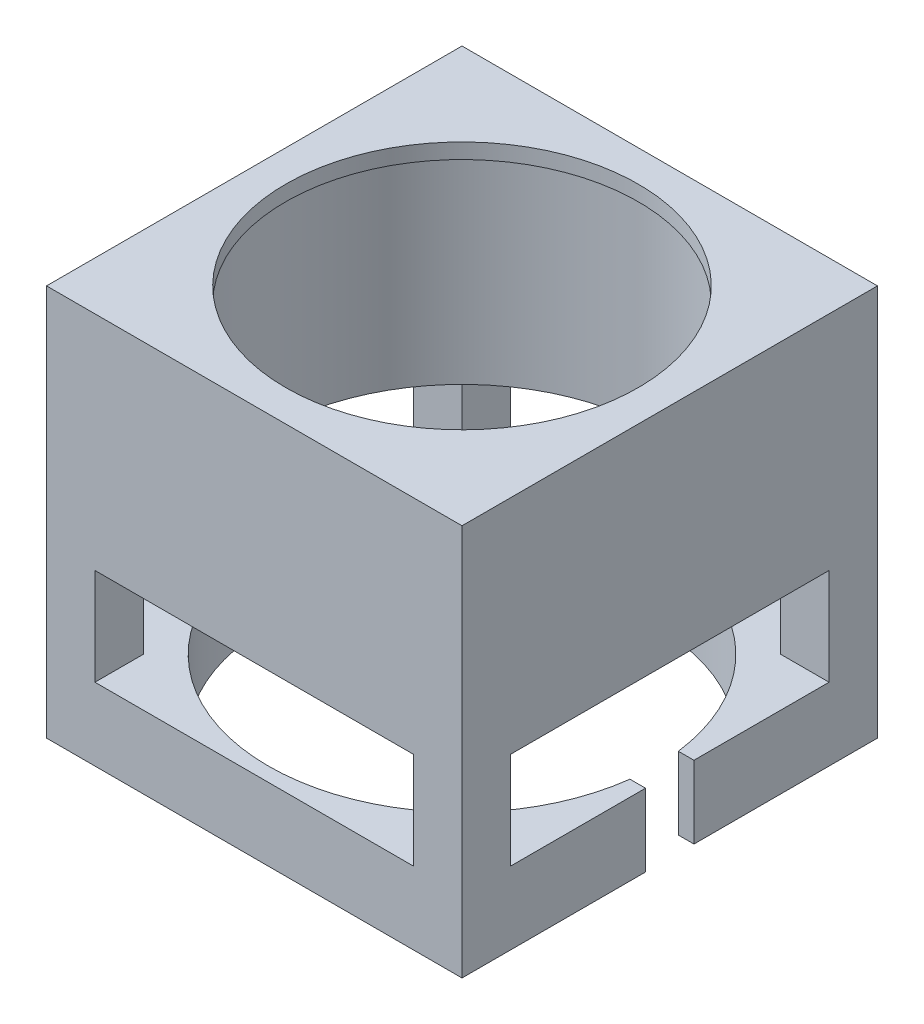
ISO-10303-21;
HEADER;
FILE_DESCRIPTION(('STEP AP214'),'2;1');
FILE_NAME('part.step','',(''),(''),'','','');
FILE_SCHEMA(('AUTOMOTIVE_DESIGN { 1 0 10303 214 1 1 1 1 }'));
ENDSEC;
DATA;
#1=APPLICATION_CONTEXT('core data for automotive mechanical design processes');
#2=APPLICATION_PROTOCOL_DEFINITION('international standard','automotive_design',2000,#1);
#3=PRODUCT_CONTEXT('',#1,'mechanical');
#4=PRODUCT('Part','Part','',(#3));
#5=PRODUCT_RELATED_PRODUCT_CATEGORY('part','',(#4));
#6=PRODUCT_DEFINITION_FORMATION('','',#4);
#7=PRODUCT_DEFINITION_CONTEXT('part definition',#1,'design');
#8=PRODUCT_DEFINITION('design','',#6,#7);
#9=PRODUCT_DEFINITION_SHAPE('','',#8);
#10=(LENGTH_UNIT() NAMED_UNIT(*) SI_UNIT(.MILLI.,.METRE.));
#11=(NAMED_UNIT(*) PLANE_ANGLE_UNIT() SI_UNIT($,.RADIAN.));
#12=(NAMED_UNIT(*) SI_UNIT($,.STERADIAN.) SOLID_ANGLE_UNIT());
#13=UNCERTAINTY_MEASURE_WITH_UNIT(LENGTH_MEASURE(1.E-05),#10,'distance_accuracy_value','');
#14=(GEOMETRIC_REPRESENTATION_CONTEXT(3) GLOBAL_UNCERTAINTY_ASSIGNED_CONTEXT((#13)) GLOBAL_UNIT_ASSIGNED_CONTEXT((#10,
#11,#12)) REPRESENTATION_CONTEXT('',''));
#15=CARTESIAN_POINT('',(0.,0.,0.));
#16=DIRECTION('',(0.,0.,1.));
#17=DIRECTION('',(1.,0.,0.));
#18=AXIS2_PLACEMENT_3D('',#15,#16,#17);
#19=CARTESIAN_POINT('',(0.,38.1,0.));
#20=DIRECTION('',(0.,-1.,0.));
#21=DIRECTION('',(0.,0.,-1.));
#22=AXIS2_PLACEMENT_3D('',#19,#20,#21);
#23=PLANE('',#22);
#24=CARTESIAN_POINT('',(0.,38.1,0.));
#25=DIRECTION('',(0.,1.,0.));
#26=DIRECTION('',(0.,0.,1.));
#27=AXIS2_PLACEMENT_3D('',#24,#25,#26);
#28=CIRCLE('',#27,101.6);
#29=CARTESIAN_POINT('',(100.803124951561,38.1,-12.7));
#30=VERTEX_POINT('',#29);
#31=CARTESIAN_POINT('',(100.803124951561,38.1,12.7));
#32=VERTEX_POINT('',#31);
#33=EDGE_CURVE('E196',#30,#32,#28,.T.);
#34=ORIENTED_EDGE('',*,*,#33,.F.);
#35=DIRECTION('',(-1.,0.,0.));
#36=VECTOR('',#35,1.);
#37=CARTESIAN_POINT('',(117.196875048439,38.1,-12.7));
#38=LINE('',#37,#36);
#39=CARTESIAN_POINT('',(109.,38.1,-12.7));
#40=VERTEX_POINT('',#39);
#41=EDGE_CURVE('E69',#40,#30,#38,.T.);
#42=ORIENTED_EDGE('',*,*,#41,.F.);
#43=DIRECTION('',(0.,0.,-1.));
#44=VECTOR('',#43,1.);
#45=CARTESIAN_POINT('',(109.,38.1,109.));
#46=LINE('',#45,#44);
#47=CARTESIAN_POINT('',(109.,38.1,-83.6));
#48=VERTEX_POINT('',#47);
#49=EDGE_CURVE('E220',#40,#48,#46,.T.);
#50=ORIENTED_EDGE('',*,*,#49,.T.);
#51=DIRECTION('',(1.,0.,0.));
#52=VECTOR('',#51,1.);
#53=CARTESIAN_POINT('',(109.,38.1,-83.6));
#54=LINE('',#53,#52);
#55=CARTESIAN_POINT('',(83.6,38.1,-83.6));
#56=VERTEX_POINT('',#55);
#57=EDGE_CURVE('E379',#56,#48,#54,.T.);
#58=ORIENTED_EDGE('',*,*,#57,.F.);
#59=DIRECTION('',(0.,0.,1.));
#60=VECTOR('',#59,1.);
#61=CARTESIAN_POINT('',(83.6,38.1,-109.));
#62=LINE('',#61,#60);
#63=CARTESIAN_POINT('',(83.6,38.1,-109.));
#64=VERTEX_POINT('',#63);
#65=EDGE_CURVE('E383',#64,#56,#62,.T.);
#66=ORIENTED_EDGE('',*,*,#65,.F.);
#67=DIRECTION('',(-1.,0.,0.));
#68=VECTOR('',#67,1.);
#69=CARTESIAN_POINT('',(-109.,38.1,-109.));
#70=LINE('',#69,#68);
#71=CARTESIAN_POINT('',(-83.6,38.1,-109.));
#72=VERTEX_POINT('',#71);
#73=EDGE_CURVE('E219',#64,#72,#70,.T.);
#74=ORIENTED_EDGE('',*,*,#73,.T.);
#75=DIRECTION('',(0.,0.,-1.));
#76=VECTOR('',#75,1.);
#77=CARTESIAN_POINT('',(-83.6,38.1,-109.));
#78=LINE('',#77,#76);
#79=CARTESIAN_POINT('',(-83.6,38.1,-83.6));
#80=VERTEX_POINT('',#79);
#81=EDGE_CURVE('E400',#80,#72,#78,.T.);
#82=ORIENTED_EDGE('',*,*,#81,.F.);
#83=DIRECTION('',(1.,0.,0.));
#84=VECTOR('',#83,1.);
#85=CARTESIAN_POINT('',(-109.,38.1,-83.6));
#86=LINE('',#85,#84);
#87=CARTESIAN_POINT('',(-109.,38.1,-83.6));
#88=VERTEX_POINT('',#87);
#89=EDGE_CURVE('E388',#88,#80,#86,.T.);
#90=ORIENTED_EDGE('',*,*,#89,.F.);
#91=DIRECTION('',(0.,0.,1.));
#92=VECTOR('',#91,1.);
#93=CARTESIAN_POINT('',(-109.,38.1,109.));
#94=LINE('',#93,#92);
#95=CARTESIAN_POINT('',(-109.,38.1,83.6));
#96=VERTEX_POINT('',#95);
#97=EDGE_CURVE('E223',#88,#96,#94,.T.);
#98=ORIENTED_EDGE('',*,*,#97,.T.);
#99=DIRECTION('',(-1.,0.,0.));
#100=VECTOR('',#99,1.);
#101=CARTESIAN_POINT('',(-109.,38.1,83.6));
#102=LINE('',#101,#100);
#103=CARTESIAN_POINT('',(-83.6,38.1,83.6));
#104=VERTEX_POINT('',#103);
#105=EDGE_CURVE('E323',#104,#96,#102,.T.);
#106=ORIENTED_EDGE('',*,*,#105,.F.);
#107=DIRECTION('',(0.,0.,-1.));
#108=VECTOR('',#107,1.);
#109=CARTESIAN_POINT('',(-83.6,38.1,109.));
#110=LINE('',#109,#108);
#111=CARTESIAN_POINT('',(-83.6,38.1,109.));
#112=VERTEX_POINT('',#111);
#113=EDGE_CURVE('E327',#112,#104,#110,.T.);
#114=ORIENTED_EDGE('',*,*,#113,.F.);
#115=DIRECTION('',(1.,0.,0.));
#116=VECTOR('',#115,1.);
#117=CARTESIAN_POINT('',(-109.,38.1,109.));
#118=LINE('',#117,#116);
#119=CARTESIAN_POINT('',(83.6,38.1,109.));
#120=VERTEX_POINT('',#119);
#121=EDGE_CURVE('E226',#112,#120,#118,.T.);
#122=ORIENTED_EDGE('',*,*,#121,.T.);
#123=DIRECTION('',(0.,0.,1.));
#124=VECTOR('',#123,1.);
#125=CARTESIAN_POINT('',(83.6,38.1,109.));
#126=LINE('',#125,#124);
#127=CARTESIAN_POINT('',(83.6,38.1,83.6));
#128=VERTEX_POINT('',#127);
#129=EDGE_CURVE('E351',#128,#120,#126,.T.);
#130=ORIENTED_EDGE('',*,*,#129,.F.);
#131=DIRECTION('',(-1.,0.,0.));
#132=VECTOR('',#131,1.);
#133=CARTESIAN_POINT('',(109.,38.1,83.6));
#134=LINE('',#133,#132);
#135=CARTESIAN_POINT('',(109.,38.1,83.6));
#136=VERTEX_POINT('',#135);
#137=EDGE_CURVE('E355',#136,#128,#134,.T.);
#138=ORIENTED_EDGE('',*,*,#137,.F.);
#139=CARTESIAN_POINT('',(109.,38.1,12.7));
#140=VERTEX_POINT('',#139);
#141=EDGE_CURVE('E198',#136,#140,#46,.T.);
#142=ORIENTED_EDGE('',*,*,#141,.T.);
#143=DIRECTION('',(1.,0.,0.));
#144=VECTOR('',#143,1.);
#145=CARTESIAN_POINT('',(117.196875048439,38.1,12.7));
#146=LINE('',#145,#144);
#147=EDGE_CURVE('E183',#32,#140,#146,.T.);
#148=ORIENTED_EDGE('',*,*,#147,.F.);
#149=EDGE_LOOP('',(#34,#42,#50,#58,#66,#74,#82,#90,#98,#106,#114,#122,#130,#138,#142,#148));
#150=FACE_BOUND('',#149,.T.);
#151=ADVANCED_FACE('F45',(#150),#23,.F.);
#152=CARTESIAN_POINT('',(0.,0.,0.));
#153=DIRECTION('',(0.,-1.,0.));
#154=DIRECTION('',(0.,0.,-1.));
#155=AXIS2_PLACEMENT_3D('',#152,#153,#154);
#156=PLANE('',#155);
#157=DIRECTION('',(1.,0.,0.));
#158=VECTOR('',#157,1.);
#159=CARTESIAN_POINT('',(117.196875048439,0.,-12.7));
#160=LINE('',#159,#158);
#161=CARTESIAN_POINT('',(100.803124951561,0.,-12.7));
#162=VERTEX_POINT('',#161);
#163=CARTESIAN_POINT('',(109.,0.,-12.7));
#164=VERTEX_POINT('',#163);
#165=EDGE_CURVE('E200',#162,#164,#160,.T.);
#166=ORIENTED_EDGE('',*,*,#165,.F.);
#167=CARTESIAN_POINT('',(0.,0.,0.));
#168=DIRECTION('',(0.,1.,0.));
#169=DIRECTION('',(0.,0.,1.));
#170=AXIS2_PLACEMENT_3D('',#167,#168,#169);
#171=CIRCLE('',#170,101.6);
#172=CARTESIAN_POINT('',(100.803124951561,0.,12.7));
#173=VERTEX_POINT('',#172);
#174=EDGE_CURVE('E206',#162,#173,#171,.T.);
#175=ORIENTED_EDGE('',*,*,#174,.T.);
#176=DIRECTION('',(-1.,0.,0.));
#177=VECTOR('',#176,1.);
#178=CARTESIAN_POINT('',(117.196875048439,0.,12.7));
#179=LINE('',#178,#177);
#180=CARTESIAN_POINT('',(109.,0.,12.7));
#181=VERTEX_POINT('',#180);
#182=EDGE_CURVE('E61',#181,#173,#179,.T.);
#183=ORIENTED_EDGE('',*,*,#182,.F.);
#184=DIRECTION('',(0.,0.,-1.));
#185=VECTOR('',#184,1.);
#186=CARTESIAN_POINT('',(109.,0.,109.));
#187=LINE('',#186,#185);
#188=CARTESIAN_POINT('',(109.,0.,109.));
#189=VERTEX_POINT('',#188);
#190=EDGE_CURVE('E210',#189,#181,#187,.T.);
#191=ORIENTED_EDGE('',*,*,#190,.F.);
#192=DIRECTION('',(1.,0.,0.));
#193=VECTOR('',#192,1.);
#194=CARTESIAN_POINT('',(-109.,0.,109.));
#195=LINE('',#194,#193);
#196=CARTESIAN_POINT('',(-109.,0.,109.));
#197=VERTEX_POINT('',#196);
#198=EDGE_CURVE('E238',#197,#189,#195,.T.);
#199=ORIENTED_EDGE('',*,*,#198,.F.);
#200=DIRECTION('',(0.,0.,1.));
#201=VECTOR('',#200,1.);
#202=CARTESIAN_POINT('',(-109.,0.,109.));
#203=LINE('',#202,#201);
#204=CARTESIAN_POINT('',(-109.,0.,-109.));
#205=VERTEX_POINT('',#204);
#206=EDGE_CURVE('E235',#205,#197,#203,.T.);
#207=ORIENTED_EDGE('',*,*,#206,.F.);
#208=DIRECTION('',(-1.,0.,0.));
#209=VECTOR('',#208,1.);
#210=CARTESIAN_POINT('',(-109.,0.,-109.));
#211=LINE('',#210,#209);
#212=CARTESIAN_POINT('',(109.,0.,-109.));
#213=VERTEX_POINT('',#212);
#214=EDGE_CURVE('E232',#213,#205,#211,.T.);
#215=ORIENTED_EDGE('',*,*,#214,.F.);
#216=EDGE_CURVE('E205',#164,#213,#187,.T.);
#217=ORIENTED_EDGE('',*,*,#216,.F.);
#218=EDGE_LOOP('',(#166,#175,#183,#191,#199,#207,#215,#217));
#219=FACE_BOUND('',#218,.T.);
#220=ADVANCED_FACE('F262',(#219),#156,.T.);
#221=CARTESIAN_POINT('',(109.,38.1,109.));
#222=DIRECTION('',(-1.,0.,0.));
#223=DIRECTION('',(0.,0.,1.));
#224=AXIS2_PLACEMENT_3D('',#221,#222,#223);
#225=PLANE('',#224);
#226=ORIENTED_EDGE('',*,*,#49,.F.);
#227=DIRECTION('',(0.,1.,0.));
#228=VECTOR('',#227,1.);
#229=CARTESIAN_POINT('',(109.,205.501,-12.7));
#230=LINE('',#229,#228);
#231=EDGE_CURVE('E190',#164,#40,#230,.T.);
#232=ORIENTED_EDGE('',*,*,#231,.F.);
#233=ORIENTED_EDGE('',*,*,#216,.T.);
#234=DIRECTION('',(0.,-1.,0.));
#235=VECTOR('',#234,1.);
#236=CARTESIAN_POINT('',(109.,38.1,-109.));
#237=LINE('',#236,#235);
#238=CARTESIAN_POINT('',(109.,205.5,-109.));
#239=VERTEX_POINT('',#238);
#240=EDGE_CURVE('E11',#239,#213,#237,.T.);
#241=ORIENTED_EDGE('',*,*,#240,.F.);
#242=DIRECTION('',(0.,0.,-1.));
#243=VECTOR('',#242,1.);
#244=CARTESIAN_POINT('',(109.,205.5,-109.));
#245=LINE('',#244,#243);
#246=CARTESIAN_POINT('',(109.,205.5,109.));
#247=VERTEX_POINT('',#246);
#248=EDGE_CURVE('E274',#247,#239,#245,.T.);
#249=ORIENTED_EDGE('',*,*,#248,.F.);
#250=DIRECTION('',(0.,-1.,0.));
#251=VECTOR('',#250,1.);
#252=CARTESIAN_POINT('',(109.,38.1,109.));
#253=LINE('',#252,#251);
#254=EDGE_CURVE('E228',#247,#189,#253,.T.);
#255=ORIENTED_EDGE('',*,*,#254,.T.);
#256=ORIENTED_EDGE('',*,*,#190,.T.);
#257=DIRECTION('',(0.,-1.,0.));
#258=VECTOR('',#257,1.);
#259=CARTESIAN_POINT('',(109.,205.501,12.7));
#260=LINE('',#259,#258);
#261=EDGE_CURVE('E201',#140,#181,#260,.T.);
#262=ORIENTED_EDGE('',*,*,#261,.F.);
#263=ORIENTED_EDGE('',*,*,#141,.F.);
#264=DIRECTION('',(0.,-1.,0.));
#265=VECTOR('',#264,1.);
#266=CARTESIAN_POINT('',(109.,88.9,83.6));
#267=LINE('',#266,#265);
#268=CARTESIAN_POINT('',(109.,88.9,83.6));
#269=VERTEX_POINT('',#268);
#270=EDGE_CURVE('E332',#269,#136,#267,.T.);
#271=ORIENTED_EDGE('',*,*,#270,.F.);
#272=DIRECTION('',(0.,0.,-1.));
#273=VECTOR('',#272,1.);
#274=CARTESIAN_POINT('',(109.,88.9,-109.));
#275=LINE('',#274,#273);
#276=CARTESIAN_POINT('',(109.,88.9,-83.6));
#277=VERTEX_POINT('',#276);
#278=EDGE_CURVE('E302',#269,#277,#275,.T.);
#279=ORIENTED_EDGE('',*,*,#278,.T.);
#280=DIRECTION('',(0.,-1.,0.));
#281=VECTOR('',#280,1.);
#282=CARTESIAN_POINT('',(109.,88.9,-83.6));
#283=LINE('',#282,#281);
#284=EDGE_CURVE('E374',#277,#48,#283,.T.);
#285=ORIENTED_EDGE('',*,*,#284,.T.);
#286=EDGE_LOOP('',(#226,#232,#233,#241,#249,#255,#256,#262,#263,#271,#279,#285));
#287=FACE_BOUND('',#286,.T.);
#288=ADVANCED_FACE('F47',(#287),#225,.F.);
#289=CARTESIAN_POINT('',(-109.,38.1,-109.));
#290=DIRECTION('',(0.,0.,1.));
#291=DIRECTION('',(1.,0.,0.));
#292=AXIS2_PLACEMENT_3D('',#289,#290,#291);
#293=PLANE('',#292);
#294=DIRECTION('',(0.,-1.,0.));
#295=VECTOR('',#294,1.);
#296=CARTESIAN_POINT('',(-109.,38.1,-109.));
#297=LINE('',#296,#295);
#298=CARTESIAN_POINT('',(-109.,205.5,-109.));
#299=VERTEX_POINT('',#298);
#300=EDGE_CURVE('E54',#299,#205,#297,.T.);
#301=ORIENTED_EDGE('',*,*,#300,.F.);
#302=DIRECTION('',(-1.,0.,0.));
#303=VECTOR('',#302,1.);
#304=CARTESIAN_POINT('',(-109.,205.5,-109.));
#305=LINE('',#304,#303);
#306=EDGE_CURVE('E277',#239,#299,#305,.T.);
#307=ORIENTED_EDGE('',*,*,#306,.F.);
#308=ORIENTED_EDGE('',*,*,#240,.T.);
#309=ORIENTED_EDGE('',*,*,#214,.T.);
#310=EDGE_LOOP('',(#301,#307,#308,#309));
#311=FACE_BOUND('',#310,.T.);
#312=DIRECTION('',(-1.,0.,0.));
#313=VECTOR('',#312,1.);
#314=CARTESIAN_POINT('',(-109.,88.9,-109.));
#315=LINE('',#314,#313);
#316=CARTESIAN_POINT('',(83.6,88.9,-109.));
#317=VERTEX_POINT('',#316);
#318=CARTESIAN_POINT('',(-83.6,88.9,-109.));
#319=VERTEX_POINT('',#318);
#320=EDGE_CURVE('E306',#317,#319,#315,.T.);
#321=ORIENTED_EDGE('',*,*,#320,.T.);
#322=DIRECTION('',(0.,-1.,0.));
#323=VECTOR('',#322,1.);
#324=CARTESIAN_POINT('',(-83.6,88.9,-109.));
#325=LINE('',#324,#323);
#326=EDGE_CURVE('E404',#319,#72,#325,.T.);
#327=ORIENTED_EDGE('',*,*,#326,.T.);
#328=ORIENTED_EDGE('',*,*,#73,.F.);
#329=DIRECTION('',(0.,-1.,0.));
#330=VECTOR('',#329,1.);
#331=CARTESIAN_POINT('',(83.6,88.9,-109.));
#332=LINE('',#331,#330);
#333=EDGE_CURVE('E360',#317,#64,#332,.T.);
#334=ORIENTED_EDGE('',*,*,#333,.F.);
#335=EDGE_LOOP('',(#321,#327,#328,#334));
#336=FACE_BOUND('',#335,.T.);
#337=ADVANCED_FACE('F464',(#311,#336),#293,.F.);
#338=CARTESIAN_POINT('',(-109.,38.1,109.));
#339=DIRECTION('',(1.,0.,0.));
#340=DIRECTION('',(0.,0.,-1.));
#341=AXIS2_PLACEMENT_3D('',#338,#339,#340);
#342=PLANE('',#341);
#343=DIRECTION('',(0.,-1.,0.));
#344=VECTOR('',#343,1.);
#345=CARTESIAN_POINT('',(-109.,88.9,-83.6));
#346=LINE('',#345,#344);
#347=CARTESIAN_POINT('',(-109.,88.9,-83.6));
#348=VERTEX_POINT('',#347);
#349=EDGE_CURVE('E212',#348,#88,#346,.T.);
#350=ORIENTED_EDGE('',*,*,#349,.F.);
#351=DIRECTION('',(0.,0.,1.));
#352=VECTOR('',#351,1.);
#353=CARTESIAN_POINT('',(-109.,88.9,-109.));
#354=LINE('',#353,#352);
#355=CARTESIAN_POINT('',(-109.,88.9,83.6));
#356=VERTEX_POINT('',#355);
#357=EDGE_CURVE('E294',#348,#356,#354,.T.);
#358=ORIENTED_EDGE('',*,*,#357,.T.);
#359=DIRECTION('',(0.,-1.,0.));
#360=VECTOR('',#359,1.);
#361=CARTESIAN_POINT('',(-109.,88.9,83.6));
#362=LINE('',#361,#360);
#363=EDGE_CURVE('E318',#356,#96,#362,.T.);
#364=ORIENTED_EDGE('',*,*,#363,.T.);
#365=ORIENTED_EDGE('',*,*,#97,.F.);
#366=EDGE_LOOP('',(#350,#358,#364,#365));
#367=FACE_BOUND('',#366,.T.);
#368=ORIENTED_EDGE('',*,*,#206,.T.);
#369=DIRECTION('',(0.,-1.,0.));
#370=VECTOR('',#369,1.);
#371=CARTESIAN_POINT('',(-109.,38.1,109.));
#372=LINE('',#371,#370);
#373=CARTESIAN_POINT('',(-109.,205.5,109.));
#374=VERTEX_POINT('',#373);
#375=EDGE_CURVE('E244',#374,#197,#372,.T.);
#376=ORIENTED_EDGE('',*,*,#375,.F.);
#377=DIRECTION('',(0.,0.,1.));
#378=VECTOR('',#377,1.);
#379=CARTESIAN_POINT('',(-109.,205.5,-109.));
#380=LINE('',#379,#378);
#381=EDGE_CURVE('E254',#299,#374,#380,.T.);
#382=ORIENTED_EDGE('',*,*,#381,.F.);
#383=ORIENTED_EDGE('',*,*,#300,.T.);
#384=EDGE_LOOP('',(#368,#376,#382,#383));
#385=FACE_BOUND('',#384,.T.);
#386=ADVANCED_FACE('F252',(#367,#385),#342,.F.);
#387=CARTESIAN_POINT('',(-109.,38.1,109.));
#388=DIRECTION('',(0.,0.,-1.));
#389=DIRECTION('',(-1.,0.,0.));
#390=AXIS2_PLACEMENT_3D('',#387,#388,#389);
#391=PLANE('',#390);
#392=ORIENTED_EDGE('',*,*,#254,.F.);
#393=DIRECTION('',(1.,0.,0.));
#394=VECTOR('',#393,1.);
#395=CARTESIAN_POINT('',(-109.,205.5,109.));
#396=LINE('',#395,#394);
#397=EDGE_CURVE('E278',#374,#247,#396,.T.);
#398=ORIENTED_EDGE('',*,*,#397,.F.);
#399=ORIENTED_EDGE('',*,*,#375,.T.);
#400=ORIENTED_EDGE('',*,*,#198,.T.);
#401=EDGE_LOOP('',(#392,#398,#399,#400));
#402=FACE_BOUND('',#401,.T.);
#403=DIRECTION('',(1.,0.,0.));
#404=VECTOR('',#403,1.);
#405=CARTESIAN_POINT('',(-109.,88.9,109.));
#406=LINE('',#405,#404);
#407=CARTESIAN_POINT('',(-83.6,88.9,109.));
#408=VERTEX_POINT('',#407);
#409=CARTESIAN_POINT('',(83.6,88.9,109.));
#410=VERTEX_POINT('',#409);
#411=EDGE_CURVE('E298',#408,#410,#406,.T.);
#412=ORIENTED_EDGE('',*,*,#411,.T.);
#413=DIRECTION('',(0.,-1.,0.));
#414=VECTOR('',#413,1.);
#415=CARTESIAN_POINT('',(83.6,88.9,109.));
#416=LINE('',#415,#414);
#417=EDGE_CURVE('E346',#410,#120,#416,.T.);
#418=ORIENTED_EDGE('',*,*,#417,.T.);
#419=ORIENTED_EDGE('',*,*,#121,.F.);
#420=DIRECTION('',(0.,-1.,0.));
#421=VECTOR('',#420,1.);
#422=CARTESIAN_POINT('',(-83.6,88.9,109.));
#423=LINE('',#422,#421);
#424=EDGE_CURVE('E310',#408,#112,#423,.T.);
#425=ORIENTED_EDGE('',*,*,#424,.F.);
#426=EDGE_LOOP('',(#412,#418,#419,#425));
#427=FACE_BOUND('',#426,.T.);
#428=ADVANCED_FACE('F266',(#402,#427),#391,.F.);
#429=CARTESIAN_POINT('',(0.,38.1,0.));
#430=DIRECTION('',(0.,-1.,0.));
#431=DIRECTION('',(0.,0.,-1.));
#432=AXIS2_PLACEMENT_3D('',#429,#430,#431);
#433=CYLINDRICAL_SURFACE('',#432,101.6);
#434=DIRECTION('',(0.,-1.,0.));
#435=VECTOR('',#434,1.);
#436=CARTESIAN_POINT('',(100.803124951561,38.1,-12.7));
#437=LINE('',#436,#435);
#438=EDGE_CURVE('E191',#162,#30,#437,.F.);
#439=ORIENTED_EDGE('',*,*,#438,.T.);
#440=ORIENTED_EDGE('',*,*,#33,.T.);
#441=DIRECTION('',(0.,-1.,0.));
#442=VECTOR('',#441,1.);
#443=CARTESIAN_POINT('',(100.803124951561,38.1,12.7));
#444=LINE('',#443,#442);
#445=EDGE_CURVE('E180',#32,#173,#444,.T.);
#446=ORIENTED_EDGE('',*,*,#445,.T.);
#447=ORIENTED_EDGE('',*,*,#174,.F.);
#448=EDGE_LOOP('',(#439,#440,#446,#447));
#449=FACE_BOUND('',#448,.T.);
#450=ADVANCED_FACE('F203',(#449),#433,.F.);
#451=CARTESIAN_POINT('',(-109.,88.9,-83.6));
#452=DIRECTION('',(0.,0.,-1.));
#453=DIRECTION('',(-1.,0.,0.));
#454=AXIS2_PLACEMENT_3D('',#451,#452,#453);
#455=PLANE('',#454);
#456=ORIENTED_EDGE('',*,*,#89,.T.);
#457=DIRECTION('',(0.,-1.,0.));
#458=VECTOR('',#457,1.);
#459=CARTESIAN_POINT('',(-83.6,88.9,-83.6));
#460=LINE('',#459,#458);
#461=CARTESIAN_POINT('',(-83.6,88.9,-83.6));
#462=VERTEX_POINT('',#461);
#463=EDGE_CURVE('E413',#462,#80,#460,.T.);
#464=ORIENTED_EDGE('',*,*,#463,.F.);
#465=DIRECTION('',(1.,0.,0.));
#466=VECTOR('',#465,1.);
#467=CARTESIAN_POINT('',(-109.,88.9,-83.6));
#468=LINE('',#467,#466);
#469=EDGE_CURVE('E395',#348,#462,#468,.T.);
#470=ORIENTED_EDGE('',*,*,#469,.F.);
#471=ORIENTED_EDGE('',*,*,#349,.T.);
#472=EDGE_LOOP('',(#456,#464,#470,#471));
#473=FACE_BOUND('',#472,.T.);
#474=ADVANCED_FACE('F422',(#473),#455,.F.);
#475=CARTESIAN_POINT('',(-83.6,88.9,-109.));
#476=DIRECTION('',(-1.,0.,0.));
#477=DIRECTION('',(0.,0.,1.));
#478=AXIS2_PLACEMENT_3D('',#475,#476,#477);
#479=PLANE('',#478);
#480=ORIENTED_EDGE('',*,*,#81,.T.);
#481=ORIENTED_EDGE('',*,*,#326,.F.);
#482=DIRECTION('',(0.,0.,-1.));
#483=VECTOR('',#482,1.);
#484=CARTESIAN_POINT('',(-83.6,88.9,-109.));
#485=LINE('',#484,#483);
#486=EDGE_CURVE('E399',#462,#319,#485,.T.);
#487=ORIENTED_EDGE('',*,*,#486,.F.);
#488=ORIENTED_EDGE('',*,*,#463,.T.);
#489=EDGE_LOOP('',(#480,#481,#487,#488));
#490=FACE_BOUND('',#489,.T.);
#491=ADVANCED_FACE('F469',(#490),#479,.F.);
#492=CARTESIAN_POINT('',(83.6,88.9,-109.));
#493=DIRECTION('',(1.,0.,0.));
#494=DIRECTION('',(0.,0.,-1.));
#495=AXIS2_PLACEMENT_3D('',#492,#493,#494);
#496=PLANE('',#495);
#497=ORIENTED_EDGE('',*,*,#65,.T.);
#498=DIRECTION('',(0.,-1.,0.));
#499=VECTOR('',#498,1.);
#500=CARTESIAN_POINT('',(83.6,88.9,-83.6));
#501=LINE('',#500,#499);
#502=CARTESIAN_POINT('',(83.6,88.9,-83.6));
#503=VERTEX_POINT('',#502);
#504=EDGE_CURVE('E370',#503,#56,#501,.T.);
#505=ORIENTED_EDGE('',*,*,#504,.F.);
#506=DIRECTION('',(0.,0.,1.));
#507=VECTOR('',#506,1.);
#508=CARTESIAN_POINT('',(83.6,88.9,-109.));
#509=LINE('',#508,#507);
#510=EDGE_CURVE('E384',#317,#503,#509,.T.);
#511=ORIENTED_EDGE('',*,*,#510,.F.);
#512=ORIENTED_EDGE('',*,*,#333,.T.);
#513=EDGE_LOOP('',(#497,#505,#511,#512));
#514=FACE_BOUND('',#513,.T.);
#515=ADVANCED_FACE('F472',(#514),#496,.F.);
#516=CARTESIAN_POINT('',(109.,88.9,-83.6));
#517=DIRECTION('',(0.,0.,-1.));
#518=DIRECTION('',(-1.,0.,0.));
#519=AXIS2_PLACEMENT_3D('',#516,#517,#518);
#520=PLANE('',#519);
#521=ORIENTED_EDGE('',*,*,#57,.T.);
#522=ORIENTED_EDGE('',*,*,#284,.F.);
#523=DIRECTION('',(1.,0.,0.));
#524=VECTOR('',#523,1.);
#525=CARTESIAN_POINT('',(109.,88.9,-83.6));
#526=LINE('',#525,#524);
#527=EDGE_CURVE('E378',#503,#277,#526,.T.);
#528=ORIENTED_EDGE('',*,*,#527,.F.);
#529=ORIENTED_EDGE('',*,*,#504,.T.);
#530=EDGE_LOOP('',(#521,#522,#528,#529));
#531=FACE_BOUND('',#530,.T.);
#532=ADVANCED_FACE('F475',(#531),#520,.F.);
#533=CARTESIAN_POINT('',(109.,88.9,83.6));
#534=DIRECTION('',(0.,0.,1.));
#535=DIRECTION('',(1.,0.,0.));
#536=AXIS2_PLACEMENT_3D('',#533,#534,#535);
#537=PLANE('',#536);
#538=ORIENTED_EDGE('',*,*,#137,.T.);
#539=DIRECTION('',(0.,-1.,0.));
#540=VECTOR('',#539,1.);
#541=CARTESIAN_POINT('',(83.6,88.9,83.6));
#542=LINE('',#541,#540);
#543=CARTESIAN_POINT('',(83.6,88.9,83.6));
#544=VERTEX_POINT('',#543);
#545=EDGE_CURVE('E342',#544,#128,#542,.T.);
#546=ORIENTED_EDGE('',*,*,#545,.F.);
#547=DIRECTION('',(-1.,0.,0.));
#548=VECTOR('',#547,1.);
#549=CARTESIAN_POINT('',(109.,88.9,83.6));
#550=LINE('',#549,#548);
#551=EDGE_CURVE('E356',#269,#544,#550,.T.);
#552=ORIENTED_EDGE('',*,*,#551,.F.);
#553=ORIENTED_EDGE('',*,*,#270,.T.);
#554=EDGE_LOOP('',(#538,#546,#552,#553));
#555=FACE_BOUND('',#554,.T.);
#556=ADVANCED_FACE('F442',(#555),#537,.F.);
#557=CARTESIAN_POINT('',(83.6,88.9,109.));
#558=DIRECTION('',(1.,0.,0.));
#559=DIRECTION('',(0.,0.,-1.));
#560=AXIS2_PLACEMENT_3D('',#557,#558,#559);
#561=PLANE('',#560);
#562=ORIENTED_EDGE('',*,*,#129,.T.);
#563=ORIENTED_EDGE('',*,*,#417,.F.);
#564=DIRECTION('',(0.,0.,1.));
#565=VECTOR('',#564,1.);
#566=CARTESIAN_POINT('',(83.6,88.9,109.));
#567=LINE('',#566,#565);
#568=EDGE_CURVE('E350',#544,#410,#567,.T.);
#569=ORIENTED_EDGE('',*,*,#568,.F.);
#570=ORIENTED_EDGE('',*,*,#545,.T.);
#571=EDGE_LOOP('',(#562,#563,#569,#570));
#572=FACE_BOUND('',#571,.T.);
#573=ADVANCED_FACE('F440',(#572),#561,.F.);
#574=CARTESIAN_POINT('',(-83.6,88.9,109.));
#575=DIRECTION('',(-1.,0.,0.));
#576=DIRECTION('',(0.,0.,1.));
#577=AXIS2_PLACEMENT_3D('',#574,#575,#576);
#578=PLANE('',#577);
#579=ORIENTED_EDGE('',*,*,#113,.T.);
#580=DIRECTION('',(0.,-1.,0.));
#581=VECTOR('',#580,1.);
#582=CARTESIAN_POINT('',(-83.6,88.9,83.6));
#583=LINE('',#582,#581);
#584=CARTESIAN_POINT('',(-83.6,88.9,83.6));
#585=VERTEX_POINT('',#584);
#586=EDGE_CURVE('E314',#585,#104,#583,.T.);
#587=ORIENTED_EDGE('',*,*,#586,.F.);
#588=DIRECTION('',(0.,0.,-1.));
#589=VECTOR('',#588,1.);
#590=CARTESIAN_POINT('',(-83.6,88.9,109.));
#591=LINE('',#590,#589);
#592=EDGE_CURVE('E328',#408,#585,#591,.T.);
#593=ORIENTED_EDGE('',*,*,#592,.F.);
#594=ORIENTED_EDGE('',*,*,#424,.T.);
#595=EDGE_LOOP('',(#579,#587,#593,#594));
#596=FACE_BOUND('',#595,.T.);
#597=ADVANCED_FACE('F434',(#596),#578,.F.);
#598=CARTESIAN_POINT('',(-109.,88.9,83.6));
#599=DIRECTION('',(0.,0.,1.));
#600=DIRECTION('',(1.,0.,0.));
#601=AXIS2_PLACEMENT_3D('',#598,#599,#600);
#602=PLANE('',#601);
#603=ORIENTED_EDGE('',*,*,#105,.T.);
#604=ORIENTED_EDGE('',*,*,#363,.F.);
#605=DIRECTION('',(-1.,0.,0.));
#606=VECTOR('',#605,1.);
#607=CARTESIAN_POINT('',(-109.,88.9,83.6));
#608=LINE('',#607,#606);
#609=EDGE_CURVE('E322',#585,#356,#608,.T.);
#610=ORIENTED_EDGE('',*,*,#609,.F.);
#611=ORIENTED_EDGE('',*,*,#586,.T.);
#612=EDGE_LOOP('',(#603,#604,#610,#611));
#613=FACE_BOUND('',#612,.T.);
#614=ADVANCED_FACE('F431',(#613),#602,.F.);
#615=CARTESIAN_POINT('',(0.,88.9,0.));
#616=DIRECTION('',(0.,1.,0.));
#617=DIRECTION('',(0.,0.,1.));
#618=AXIS2_PLACEMENT_3D('',#615,#616,#617);
#619=PLANE('',#618);
#620=CARTESIAN_POINT('',(0.,88.9,0.));
#621=DIRECTION('',(0.,1.,0.));
#622=DIRECTION('',(0.,0.,1.));
#623=AXIS2_PLACEMENT_3D('',#620,#621,#622);
#624=CIRCLE('',#623,101.6);
#625=CARTESIAN_POINT('',(0.,88.9,-101.6));
#626=VERTEX_POINT('',#625);
#627=EDGE_CURVE('E290',#626,#626,#624,.T.);
#628=ORIENTED_EDGE('',*,*,#627,.T.);
#629=EDGE_LOOP('',(#628));
#630=FACE_BOUND('',#629,.T.);
#631=ORIENTED_EDGE('',*,*,#357,.F.);
#632=ORIENTED_EDGE('',*,*,#469,.T.);
#633=ORIENTED_EDGE('',*,*,#486,.T.);
#634=ORIENTED_EDGE('',*,*,#320,.F.);
#635=ORIENTED_EDGE('',*,*,#510,.T.);
#636=ORIENTED_EDGE('',*,*,#527,.T.);
#637=ORIENTED_EDGE('',*,*,#278,.F.);
#638=ORIENTED_EDGE('',*,*,#551,.T.);
#639=ORIENTED_EDGE('',*,*,#568,.T.);
#640=ORIENTED_EDGE('',*,*,#411,.F.);
#641=ORIENTED_EDGE('',*,*,#592,.T.);
#642=ORIENTED_EDGE('',*,*,#609,.T.);
#643=EDGE_LOOP('',(#631,#632,#633,#634,#635,#636,#637,#638,#639,#640,#641,#642));
#644=FACE_BOUND('',#643,.T.);
#645=ADVANCED_FACE('F427',(#630,#644),#619,.F.);
#646=CARTESIAN_POINT('',(0.,197.5,0.));
#647=DIRECTION('',(0.,-1.,0.));
#648=DIRECTION('',(0.,0.,-1.));
#649=AXIS2_PLACEMENT_3D('',#646,#647,#648);
#650=CYLINDRICAL_SURFACE('',#649,101.6);
#651=CARTESIAN_POINT('',(0.,197.5,0.));
#652=DIRECTION('',(0.,1.,0.));
#653=DIRECTION('',(0.,0.,1.));
#654=AXIS2_PLACEMENT_3D('',#651,#652,#653);
#655=CIRCLE('',#654,101.6);
#656=CARTESIAN_POINT('',(0.,197.5,-101.6));
#657=VERTEX_POINT('',#656);
#658=EDGE_CURVE('E282',#657,#657,#655,.T.);
#659=CARTESIAN_POINT('',(0.,197.5,-101.6));
#660=CARTESIAN_POINT('',(0.,196.36875,-101.6));
#661=CARTESIAN_POINT('',(0.,195.2375,-101.6));
#662=CARTESIAN_POINT('',(0.,192.975,-101.6));
#663=CARTESIAN_POINT('',(0.,191.84375,-101.6));
#664=CARTESIAN_POINT('',(0.,189.58125,-101.6));
#665=CARTESIAN_POINT('',(0.,188.45,-101.6));
#666=CARTESIAN_POINT('',(0.,186.1875,-101.6));
#667=CARTESIAN_POINT('',(0.,185.05625,-101.6));
#668=CARTESIAN_POINT('',(0.,182.79375,-101.6));
#669=CARTESIAN_POINT('',(0.,181.6625,-101.6));
#670=CARTESIAN_POINT('',(0.,179.4,-101.6));
#671=CARTESIAN_POINT('',(0.,178.26875,-101.6));
#672=CARTESIAN_POINT('',(0.,176.00625,-101.6));
#673=CARTESIAN_POINT('',(0.,174.875,-101.6));
#674=CARTESIAN_POINT('',(0.,172.6125,-101.6));
#675=CARTESIAN_POINT('',(0.,171.48125,-101.6));
#676=CARTESIAN_POINT('',(0.,169.21875,-101.6));
#677=CARTESIAN_POINT('',(0.,168.0875,-101.6));
#678=CARTESIAN_POINT('',(0.,165.825,-101.6));
#679=CARTESIAN_POINT('',(0.,164.69375,-101.6));
#680=CARTESIAN_POINT('',(0.,162.43125,-101.6));
#681=CARTESIAN_POINT('',(0.,161.3,-101.6));
#682=CARTESIAN_POINT('',(0.,159.0375,-101.6));
#683=CARTESIAN_POINT('',(0.,157.90625,-101.6));
#684=CARTESIAN_POINT('',(0.,155.64375,-101.6));
#685=CARTESIAN_POINT('',(0.,154.5125,-101.6));
#686=CARTESIAN_POINT('',(0.,152.25,-101.6));
#687=CARTESIAN_POINT('',(0.,151.11875,-101.6));
#688=CARTESIAN_POINT('',(0.,148.85625,-101.6));
#689=CARTESIAN_POINT('',(0.,147.725,-101.6));
#690=CARTESIAN_POINT('',(0.,145.4625,-101.6));
#691=CARTESIAN_POINT('',(0.,144.33125,-101.6));
#692=CARTESIAN_POINT('',(0.,142.06875,-101.6));
#693=CARTESIAN_POINT('',(0.,140.9375,-101.6));
#694=CARTESIAN_POINT('',(0.,138.675,-101.6));
#695=CARTESIAN_POINT('',(0.,137.54375,-101.6));
#696=CARTESIAN_POINT('',(0.,135.28125,-101.6));
#697=CARTESIAN_POINT('',(0.,134.15,-101.6));
#698=CARTESIAN_POINT('',(0.,131.8875,-101.6));
#699=CARTESIAN_POINT('',(0.,130.75625,-101.6));
#700=CARTESIAN_POINT('',(0.,128.49375,-101.6));
#701=CARTESIAN_POINT('',(0.,127.3625,-101.6));
#702=CARTESIAN_POINT('',(0.,125.1,-101.6));
#703=CARTESIAN_POINT('',(0.,123.96875,-101.6));
#704=CARTESIAN_POINT('',(0.,121.70625,-101.6));
#705=CARTESIAN_POINT('',(0.,120.575,-101.6));
#706=CARTESIAN_POINT('',(0.,118.3125,-101.6));
#707=CARTESIAN_POINT('',(0.,117.18125,-101.6));
#708=CARTESIAN_POINT('',(0.,114.91875,-101.6));
#709=CARTESIAN_POINT('',(0.,113.7875,-101.6));
#710=CARTESIAN_POINT('',(0.,111.525,-101.6));
#711=CARTESIAN_POINT('',(0.,110.39375,-101.6));
#712=CARTESIAN_POINT('',(0.,108.13125,-101.6));
#713=CARTESIAN_POINT('',(0.,107.,-101.6));
#714=CARTESIAN_POINT('',(0.,104.7375,-101.6));
#715=CARTESIAN_POINT('',(0.,103.60625,-101.6));
#716=CARTESIAN_POINT('',(0.,101.34375,-101.6));
#717=CARTESIAN_POINT('',(0.,100.2125,-101.6));
#718=CARTESIAN_POINT('',(0.,97.95,-101.6));
#719=CARTESIAN_POINT('',(0.,96.81875,-101.6));
#720=CARTESIAN_POINT('',(0.,94.55625,-101.6));
#721=CARTESIAN_POINT('',(0.,93.425,-101.6));
#722=CARTESIAN_POINT('',(0.,91.1625,-101.6));
#723=CARTESIAN_POINT('',(0.,90.03125,-101.6));
#724=CARTESIAN_POINT('',(0.,88.9,-101.6));
#725=B_SPLINE_CURVE_WITH_KNOTS('',3,(#659,#660,#661,#662,#663,#664,#665,#666,#667,#668,#669,
#670,#671,#672,#673,#674,#675,#676,#677,#678,#679,#680,#681,#682,#683,#684,#685,#686,#687,#688,
#689,#690,#691,#692,#693,#694,#695,#696,#697,#698,#699,#700,#701,#702,#703,#704,#705,#706,#707,
#708,#709,#710,#711,#712,#713,#714,#715,#716,#717,#718,#719,#720,#721,#722,#723,#724),
.UNSPECIFIED.,.F.,.F.,(4,2,2,2,2,2,2,2,2,2,2,2,2,2,2,2,2,2,2,2,2,2,2,2,2,2,2,2,2,2,2,2,4),(0.,
3.39374999999997,6.78749999999997,10.18125,13.575,16.96875,20.3625,23.75625,27.15,30.54375,
33.9375,37.33125,40.725,44.11875,47.5125,50.90625,54.3,57.69375,61.0875,64.48125,67.875,
71.26875,74.6625,78.05625,81.45,84.84375,88.2375,91.63125,95.025,98.41875,101.8125,105.20625,
108.6),.UNSPECIFIED.);
#726=EDGE_CURVE('BSEAM520',#657,#626,#725,.T.);
#727=ORIENTED_EDGE('',*,*,#658,.T.);
#728=ORIENTED_EDGE('',*,*,#627,.F.);
#729=ORIENTED_EDGE('',*,*,#726,.T.);
#730=ORIENTED_EDGE('',*,*,#726,.F.);
#731=EDGE_LOOP('',(#727,#729,#728,#730));
#732=FACE_BOUND('',#731,.T.);
#733=ADVANCED_FACE('F520',(#732),#650,.F.);
#734=CARTESIAN_POINT('',(0.,197.5,0.));
#735=DIRECTION('',(0.,1.,0.));
#736=DIRECTION('',(0.,0.,1.));
#737=AXIS2_PLACEMENT_3D('',#734,#735,#736);
#738=PLANE('',#737);
#739=CARTESIAN_POINT('',(0.,197.5,0.));
#740=DIRECTION('',(0.,1.,0.));
#741=DIRECTION('',(0.,0.,1.));
#742=AXIS2_PLACEMENT_3D('',#739,#740,#741);
#743=CIRCLE('',#742,92.5);
#744=CARTESIAN_POINT('',(0.,197.5,92.5));
#745=VERTEX_POINT('',#744);
#746=EDGE_CURVE('E454',#745,#745,#743,.T.);
#747=ORIENTED_EDGE('',*,*,#746,.T.);
#748=EDGE_LOOP('',(#747));
#749=FACE_BOUND('',#748,.T.);
#750=ORIENTED_EDGE('',*,*,#658,.F.);
#751=EDGE_LOOP('',(#750));
#752=FACE_BOUND('',#751,.T.);
#753=ADVANCED_FACE('F517',(#749,#752),#738,.F.);
#754=CARTESIAN_POINT('',(0.,205.5,0.));
#755=DIRECTION('',(0.,1.,0.));
#756=DIRECTION('',(0.,0.,1.));
#757=AXIS2_PLACEMENT_3D('',#754,#755,#756);
#758=PLANE('',#757);
#759=ORIENTED_EDGE('',*,*,#381,.T.);
#760=ORIENTED_EDGE('',*,*,#397,.T.);
#761=ORIENTED_EDGE('',*,*,#248,.T.);
#762=ORIENTED_EDGE('',*,*,#306,.T.);
#763=EDGE_LOOP('',(#759,#760,#761,#762));
#764=FACE_BOUND('',#763,.T.);
#765=CARTESIAN_POINT('',(0.,205.5,0.));
#766=DIRECTION('',(0.,1.,0.));
#767=DIRECTION('',(0.,0.,1.));
#768=AXIS2_PLACEMENT_3D('',#765,#766,#767);
#769=CIRCLE('',#768,92.5);
#770=CARTESIAN_POINT('',(0.,205.5,92.5));
#771=VERTEX_POINT('',#770);
#772=EDGE_CURVE('E455',#771,#771,#769,.T.);
#773=ORIENTED_EDGE('',*,*,#772,.F.);
#774=EDGE_LOOP('',(#773));
#775=FACE_BOUND('',#774,.T.);
#776=ADVANCED_FACE('F462',(#764,#775),#758,.T.);
#777=CARTESIAN_POINT('',(0.,205.5,0.));
#778=DIRECTION('',(0.,-1.,0.));
#779=DIRECTION('',(0.,0.,-1.));
#780=AXIS2_PLACEMENT_3D('',#777,#778,#779);
#781=CYLINDRICAL_SURFACE('',#780,92.5);
#782=ORIENTED_EDGE('',*,*,#772,.T.);
#783=EDGE_LOOP('',(#782));
#784=FACE_BOUND('',#783,.T.);
#785=ORIENTED_EDGE('',*,*,#746,.F.);
#786=EDGE_LOOP('',(#785));
#787=FACE_BOUND('',#786,.T.);
#788=ADVANCED_FACE('F486',(#784,#787),#781,.F.);
#789=CARTESIAN_POINT('',(117.196875048439,205.501,12.7));
#790=DIRECTION('',(0.,0.,1.));
#791=DIRECTION('',(1.,0.,0.));
#792=AXIS2_PLACEMENT_3D('',#789,#790,#791);
#793=PLANE('',#792);
#794=ORIENTED_EDGE('',*,*,#147,.T.);
#795=ORIENTED_EDGE('',*,*,#261,.T.);
#796=ORIENTED_EDGE('',*,*,#182,.T.);
#797=ORIENTED_EDGE('',*,*,#445,.F.);
#798=EDGE_LOOP('',(#794,#795,#796,#797));
#799=FACE_BOUND('',#798,.T.);
#800=ADVANCED_FACE('F182',(#799),#793,.F.);
#801=CARTESIAN_POINT('',(117.196875048439,205.501,-12.7));
#802=DIRECTION('',(0.,0.,-1.));
#803=DIRECTION('',(-1.,0.,0.));
#804=AXIS2_PLACEMENT_3D('',#801,#802,#803);
#805=PLANE('',#804);
#806=ORIENTED_EDGE('',*,*,#41,.T.);
#807=ORIENTED_EDGE('',*,*,#438,.F.);
#808=ORIENTED_EDGE('',*,*,#165,.T.);
#809=ORIENTED_EDGE('',*,*,#231,.T.);
#810=EDGE_LOOP('',(#806,#807,#808,#809));
#811=FACE_BOUND('',#810,.T.);
#812=ADVANCED_FACE('F478',(#811),#805,.F.);
#813=CLOSED_SHELL('',(#151,#220,#288,#337,#386,#428,#450,#474,#491,#515,#532,#556,#573,#597,
#614,#645,#733,#753,#776,#788,#800,#812));
#814=MANIFOLD_SOLID_BREP('B2',#813);
#815=ADVANCED_BREP_SHAPE_REPRESENTATION('',(#18,#814),#14);
#816=SHAPE_DEFINITION_REPRESENTATION(#9,#815);
ENDSEC;
END-ISO-10303-21;
